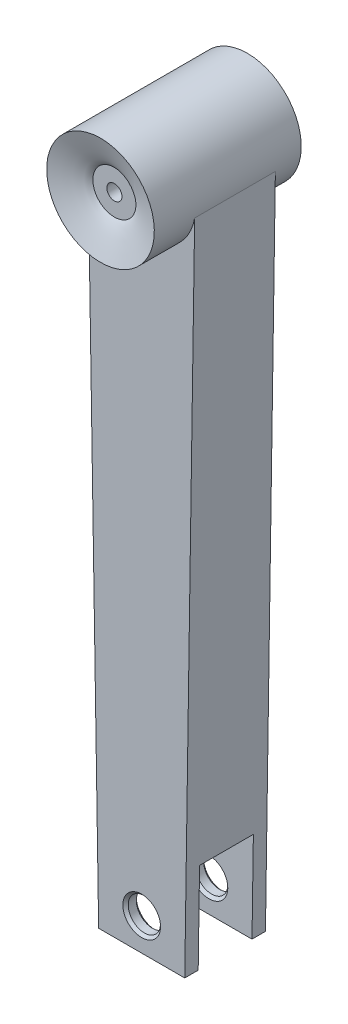
ISO-10303-21;
HEADER;
FILE_DESCRIPTION(('STEP AP214'),'2;1');
FILE_NAME('part.step','',(''),(''),'','','');
FILE_SCHEMA(('AUTOMOTIVE_DESIGN { 1 0 10303 214 1 1 1 1 }'));
ENDSEC;
DATA;
#1=APPLICATION_CONTEXT('core data for automotive mechanical design processes');
#2=APPLICATION_PROTOCOL_DEFINITION('international standard','automotive_design',2000,#1);
#3=PRODUCT_CONTEXT('',#1,'mechanical');
#4=PRODUCT('Part','Part','',(#3));
#5=PRODUCT_RELATED_PRODUCT_CATEGORY('part','',(#4));
#6=PRODUCT_DEFINITION_FORMATION('','',#4);
#7=PRODUCT_DEFINITION_CONTEXT('part definition',#1,'design');
#8=PRODUCT_DEFINITION('design','',#6,#7);
#9=PRODUCT_DEFINITION_SHAPE('','',#8);
#10=(LENGTH_UNIT() NAMED_UNIT(*) SI_UNIT(.MILLI.,.METRE.));
#11=(NAMED_UNIT(*) PLANE_ANGLE_UNIT() SI_UNIT($,.RADIAN.));
#12=(NAMED_UNIT(*) SI_UNIT($,.STERADIAN.) SOLID_ANGLE_UNIT());
#13=UNCERTAINTY_MEASURE_WITH_UNIT(LENGTH_MEASURE(1.E-05),#10,'distance_accuracy_value','');
#14=(GEOMETRIC_REPRESENTATION_CONTEXT(3) GLOBAL_UNCERTAINTY_ASSIGNED_CONTEXT((#13)) GLOBAL_UNIT_ASSIGNED_CONTEXT((#10,
#11,#12)) REPRESENTATION_CONTEXT('',''));
#15=CARTESIAN_POINT('',(0.,0.,0.));
#16=DIRECTION('',(0.,0.,1.));
#17=DIRECTION('',(1.,0.,0.));
#18=AXIS2_PLACEMENT_3D('',#15,#16,#17);
#19=CARTESIAN_POINT('',(0.,0.,28.));
#20=DIRECTION('',(0.,0.,-1.));
#21=DIRECTION('',(-1.,0.,0.));
#22=AXIS2_PLACEMENT_3D('',#19,#20,#21);
#23=CYLINDRICAL_SURFACE('',#22,4.);
#24=CARTESIAN_POINT('',(0.,0.,2.9278314769504));
#25=DIRECTION('',(0.,0.,-1.));
#26=DIRECTION('',(0.,1.,0.));
#27=AXIS2_PLACEMENT_3D('',#24,#25,#26);
#28=CIRCLE('',#27,4.);
#29=CARTESIAN_POINT('',(-4.,0.,2.9278314769504));
#30=VERTEX_POINT('',#29);
#31=EDGE_CURVE('E160',#30,#30,#28,.T.);
#32=CARTESIAN_POINT('',(0.,0.,22.0721685230496));
#33=DIRECTION('',(0.,0.,1.));
#34=DIRECTION('',(1.,0.,0.));
#35=AXIS2_PLACEMENT_3D('',#32,#33,#34);
#36=CIRCLE('',#35,4.);
#37=CARTESIAN_POINT('',(-4.,0.,22.0721685230496));
#38=VERTEX_POINT('',#37);
#39=EDGE_CURVE('E223',#38,#38,#36,.F.);
#40=CARTESIAN_POINT('',(-4.,0.,2.9278314769504));
#41=CARTESIAN_POINT('',(-4.,0.,3.12725165451393));
#42=CARTESIAN_POINT('',(-4.,0.,3.32667183207747));
#43=CARTESIAN_POINT('',(-4.,0.,3.72551218720453));
#44=CARTESIAN_POINT('',(-4.,0.,3.92493236476807));
#45=CARTESIAN_POINT('',(-4.,0.,4.32377271989513));
#46=CARTESIAN_POINT('',(-4.,0.,4.52319289745867));
#47=CARTESIAN_POINT('',(-4.,0.,4.92203325258573));
#48=CARTESIAN_POINT('',(-4.,0.,5.12145343014927));
#49=CARTESIAN_POINT('',(-4.,0.,5.52029378527633));
#50=CARTESIAN_POINT('',(-4.,0.,5.71971396283987));
#51=CARTESIAN_POINT('',(-4.,0.,6.11855431796693));
#52=CARTESIAN_POINT('',(-4.,0.,6.31797449553047));
#53=CARTESIAN_POINT('',(-4.,0.,6.71681485065753));
#54=CARTESIAN_POINT('',(-4.,0.,6.91623502822107));
#55=CARTESIAN_POINT('',(-4.,0.,7.31507538334814));
#56=CARTESIAN_POINT('',(-4.,0.,7.51449556091167));
#57=CARTESIAN_POINT('',(-4.,0.,7.91333591603873));
#58=CARTESIAN_POINT('',(-4.,0.,8.11275609360227));
#59=CARTESIAN_POINT('',(-4.,0.,8.51159644872934));
#60=CARTESIAN_POINT('',(-4.,0.,8.71101662629287));
#61=CARTESIAN_POINT('',(-4.,0.,9.10985698141993));
#62=CARTESIAN_POINT('',(-4.,0.,9.30927715898347));
#63=CARTESIAN_POINT('',(-4.,0.,9.70811751411054));
#64=CARTESIAN_POINT('',(-4.,0.,9.90753769167407));
#65=CARTESIAN_POINT('',(-4.,0.,10.3063780468011));
#66=CARTESIAN_POINT('',(-4.,0.,10.5057982243647));
#67=CARTESIAN_POINT('',(-4.,0.,10.9046385794917));
#68=CARTESIAN_POINT('',(-4.,0.,11.1040587570553));
#69=CARTESIAN_POINT('',(-4.,0.,11.5028991121823));
#70=CARTESIAN_POINT('',(-4.,0.,11.7023192897459));
#71=CARTESIAN_POINT('',(-4.,0.,12.1011596448729));
#72=CARTESIAN_POINT('',(-4.,0.,12.3005798224365));
#73=CARTESIAN_POINT('',(-4.,0.,12.6994201775635));
#74=CARTESIAN_POINT('',(-4.,0.,12.8988403551271));
#75=CARTESIAN_POINT('',(-4.,0.,13.2976807102541));
#76=CARTESIAN_POINT('',(-4.,0.,13.4971008878177));
#77=CARTESIAN_POINT('',(-4.,0.,13.8959412429447));
#78=CARTESIAN_POINT('',(-4.,0.,14.0953614205083));
#79=CARTESIAN_POINT('',(-4.,0.,14.4942017756353));
#80=CARTESIAN_POINT('',(-4.,0.,14.6936219531989));
#81=CARTESIAN_POINT('',(-4.,0.,15.0924623083259));
#82=CARTESIAN_POINT('',(-4.,0.,15.2918824858895));
#83=CARTESIAN_POINT('',(-4.,0.,15.6907228410165));
#84=CARTESIAN_POINT('',(-4.,0.,15.8901430185801));
#85=CARTESIAN_POINT('',(-4.,0.,16.2889833737071));
#86=CARTESIAN_POINT('',(-4.,0.,16.4884035512707));
#87=CARTESIAN_POINT('',(-4.,0.,16.8872439063977));
#88=CARTESIAN_POINT('',(-4.,0.,17.0866640839613));
#89=CARTESIAN_POINT('',(-4.,0.,17.4855044390883));
#90=CARTESIAN_POINT('',(-4.,0.,17.6849246166519));
#91=CARTESIAN_POINT('',(-4.,0.,18.0837649717789));
#92=CARTESIAN_POINT('',(-4.,0.,18.2831851493425));
#93=CARTESIAN_POINT('',(-4.,0.,18.6820255044695));
#94=CARTESIAN_POINT('',(-4.,0.,18.8814456820331));
#95=CARTESIAN_POINT('',(-4.,0.,19.2802860371601));
#96=CARTESIAN_POINT('',(-4.,0.,19.4797062147237));
#97=CARTESIAN_POINT('',(-4.,0.,19.8785465698507));
#98=CARTESIAN_POINT('',(-4.,0.,20.0779667474143));
#99=CARTESIAN_POINT('',(-4.,0.,20.4768071025413));
#100=CARTESIAN_POINT('',(-4.,0.,20.6762272801049));
#101=CARTESIAN_POINT('',(-4.,0.,21.0750676352319));
#102=CARTESIAN_POINT('',(-4.,0.,21.2744878127955));
#103=CARTESIAN_POINT('',(-4.,0.,21.6733281679225));
#104=CARTESIAN_POINT('',(-4.,0.,21.8727483454861));
#105=CARTESIAN_POINT('',(-4.,0.,22.0721685230496));
#106=B_SPLINE_CURVE_WITH_KNOTS('',3,(#40,#41,#42,#43,#44,#45,#46,#47,#48,#49,#50,#51,#52,#53,
#54,#55,#56,#57,#58,#59,#60,#61,#62,#63,#64,#65,#66,#67,#68,#69,#70,#71,#72,#73,#74,#75,#76,#77,
#78,#79,#80,#81,#82,#83,#84,#85,#86,#87,#88,#89,#90,#91,#92,#93,#94,#95,#96,#97,#98,#99,#100,
#101,#102,#103,#104,#105),.UNSPECIFIED.,.F.,.F.,(4,2,2,2,2,2,2,2,2,2,2,2,2,2,2,2,2,2,2,2,2,2,2,
2,2,2,2,2,2,2,2,2,4),(0.,0.5982605326906,1.1965210653812,1.7947815980718,2.3930421307624,
2.991302663453,3.5895631961436,4.1878237288342,4.7860842615248,5.3843447942154,5.982605326906,
6.5808658595966,7.1791263922872,7.7773869249778,8.3756474576684,8.973907990359,9.5721685230496,
10.1704290557402,10.7686895884308,11.3669501211214,11.965210653812,12.5634711865026,
13.1617317191932,13.7599922518838,14.3582527845744,14.956513317265,15.5547738499556,
16.1530343826462,16.7512949153368,17.3495554480274,17.947815980718,18.5460765134086,
19.1443370460992),.UNSPECIFIED.);
#107=EDGE_CURVE('BSEAM54',#30,#38,#106,.T.);
#108=ORIENTED_EDGE('',*,*,#31,.T.);
#109=ORIENTED_EDGE('',*,*,#39,.F.);
#110=ORIENTED_EDGE('',*,*,#107,.T.);
#111=ORIENTED_EDGE('',*,*,#107,.F.);
#112=EDGE_LOOP('',(#108,#110,#109,#111));
#113=FACE_BOUND('',#112,.T.);
#114=ADVANCED_FACE('F54',(#113),#23,.F.);
#115=CARTESIAN_POINT('',(-7.99999999999998,-125.,5.));
#116=DIRECTION('',(0.,-1.,0.));
#117=DIRECTION('',(0.,0.,-1.));
#118=AXIS2_PLACEMENT_3D('',#115,#116,#117);
#119=PLANE('',#118);
#120=DIRECTION('',(1.,0.,0.));
#121=VECTOR('',#120,1.);
#122=CARTESIAN_POINT('',(-7.99999999999998,-125.,7.5));
#123=LINE('',#122,#121);
#124=CARTESIAN_POINT('',(-7.99999999999999,-125.,7.5));
#125=VERTEX_POINT('',#124);
#126=CARTESIAN_POINT('',(8.00000000000002,-125.,7.5));
#127=VERTEX_POINT('',#126);
#128=EDGE_CURVE('E145',#125,#127,#123,.T.);
#129=ORIENTED_EDGE('',*,*,#128,.F.);
#130=DIRECTION('',(0.,0.,1.));
#131=VECTOR('',#130,1.);
#132=CARTESIAN_POINT('',(-7.99999999999998,-125.,5.));
#133=LINE('',#132,#131);
#134=CARTESIAN_POINT('',(-7.99999999999998,-125.,5.));
#135=VERTEX_POINT('',#134);
#136=EDGE_CURVE('E202',#135,#125,#133,.T.);
#137=ORIENTED_EDGE('',*,*,#136,.F.);
#138=DIRECTION('',(1.,0.,0.));
#139=VECTOR('',#138,1.);
#140=CARTESIAN_POINT('',(-7.99999999999998,-125.,5.));
#141=LINE('',#140,#139);
#142=CARTESIAN_POINT('',(8.00000000000002,-125.,5.));
#143=VERTEX_POINT('',#142);
#144=EDGE_CURVE('E174',#135,#143,#141,.T.);
#145=ORIENTED_EDGE('',*,*,#144,.T.);
#146=DIRECTION('',(0.,0.,1.));
#147=VECTOR('',#146,1.);
#148=CARTESIAN_POINT('',(8.00000000000002,-125.,5.));
#149=LINE('',#148,#147);
#150=EDGE_CURVE('E198',#143,#127,#149,.T.);
#151=ORIENTED_EDGE('',*,*,#150,.T.);
#152=EDGE_LOOP('',(#129,#137,#145,#151));
#153=FACE_BOUND('',#152,.T.);
#154=ADVANCED_FACE('F281',(#153),#119,.T.);
#155=CARTESIAN_POINT('',(0.,0.,28.));
#156=DIRECTION('',(0.,0.,-1.));
#157=DIRECTION('',(-1.,0.,0.));
#158=AXIS2_PLACEMENT_3D('',#155,#156,#157);
#159=CYLINDRICAL_SURFACE('',#158,10.);
#160=CARTESIAN_POINT('',(0.,0.,27.6527562815089));
#161=DIRECTION('',(0.,0.,-1.));
#162=DIRECTION('',(0.,1.,0.));
#163=AXIS2_PLACEMENT_3D('',#160,#161,#162);
#164=CIRCLE('',#163,10.);
#165=CARTESIAN_POINT('',(6.17755296118887,7.86370392446888,27.6527562815089));
#166=VERTEX_POINT('',#165);
#167=EDGE_CURVE('E156',#166,#166,#164,.T.);
#168=ORIENTED_EDGE('',*,*,#167,.T.);
#169=EDGE_LOOP('',(#168));
#170=FACE_BOUND('',#169,.T.);
#171=CARTESIAN_POINT('',(0.,0.,0.347243718491124));
#172=DIRECTION('',(0.,0.,-1.));
#173=DIRECTION('',(0.,1.,0.));
#174=AXIS2_PLACEMENT_3D('',#171,#172,#173);
#175=CIRCLE('',#174,10.);
#176=CARTESIAN_POINT('',(0.,10.,0.347243718491125));
#177=VERTEX_POINT('',#176);
#178=EDGE_CURVE('E161',#177,#177,#175,.F.);
#179=ORIENTED_EDGE('',*,*,#178,.T.);
#180=EDGE_LOOP('',(#179));
#181=FACE_BOUND('',#180,.T.);
#182=CARTESIAN_POINT('',(0.,0.,5.));
#183=DIRECTION('',(0.,0.,-1.));
#184=DIRECTION('',(1.,0.,0.));
#185=AXIS2_PLACEMENT_3D('',#182,#183,#184);
#186=CIRCLE('',#185,10.);
#187=CARTESIAN_POINT('',(9.84286813303339,-1.76577091258063,5.));
#188=VERTEX_POINT('',#187);
#189=CARTESIAN_POINT('',(-9.99871860541707,-0.160082009253309,5.));
#190=VERTEX_POINT('',#189);
#191=EDGE_CURVE('E166',#188,#190,#186,.T.);
#192=ORIENTED_EDGE('',*,*,#191,.T.);
#193=DIRECTION('',(0.,0.,1.));
#194=VECTOR('',#193,1.);
#195=CARTESIAN_POINT('',(-9.99871860541707,-0.160082009253309,5.));
#196=LINE('',#195,#194);
#197=CARTESIAN_POINT('',(-9.99871860541707,-0.160082009253309,20.));
#198=VERTEX_POINT('',#197);
#199=EDGE_CURVE('E182',#190,#198,#196,.T.);
#200=ORIENTED_EDGE('',*,*,#199,.T.);
#201=CARTESIAN_POINT('',(0.,0.,20.));
#202=DIRECTION('',(0.,0.,-1.));
#203=DIRECTION('',(1.,0.,0.));
#204=AXIS2_PLACEMENT_3D('',#201,#202,#203);
#205=CIRCLE('',#204,10.);
#206=CARTESIAN_POINT('',(9.84286813303339,-1.76577091258063,20.));
#207=VERTEX_POINT('',#206);
#208=EDGE_CURVE('E165',#207,#198,#205,.T.);
#209=ORIENTED_EDGE('',*,*,#208,.F.);
#210=DIRECTION('',(0.,0.,1.));
#211=VECTOR('',#210,1.);
#212=CARTESIAN_POINT('',(9.84286813303339,-1.76577091258063,5.));
#213=LINE('',#212,#211);
#214=EDGE_CURVE('E194',#188,#207,#213,.T.);
#215=ORIENTED_EDGE('',*,*,#214,.F.);
#216=EDGE_LOOP('',(#192,#200,#209,#215));
#217=FACE_BOUND('',#216,.T.);
#218=ADVANCED_FACE('F287',(#170,#181,#217),#159,.T.);
#219=CARTESIAN_POINT('',(9.84286813303339,-1.76577091258063,5.));
#220=DIRECTION('',(0.999888204843865,-0.0149525186545011,0.));
#221=DIRECTION('',(0.0149525186545011,0.999888204843865,0.));
#222=AXIS2_PLACEMENT_3D('',#219,#220,#221);
#223=PLANE('',#222);
#224=DIRECTION('',(0.0149525186545011,0.999888204843865,0.));
#225=VECTOR('',#224,1.);
#226=CARTESIAN_POINT('',(9.84286813303339,-1.76577091258063,7.50000000000002));
#227=LINE('',#226,#225);
#228=CARTESIAN_POINT('',(8.2542212378295,-108.,7.5));
#229=VERTEX_POINT('',#228);
#230=EDGE_CURVE('E149',#127,#229,#227,.T.);
#231=ORIENTED_EDGE('',*,*,#230,.F.);
#232=ORIENTED_EDGE('',*,*,#150,.F.);
#233=DIRECTION('',(0.0149525186545011,0.999888204843865,0.));
#234=VECTOR('',#233,1.);
#235=CARTESIAN_POINT('',(9.84286813303339,-1.76577091258063,5.));
#236=LINE('',#235,#234);
#237=EDGE_CURVE('E178',#143,#188,#236,.T.);
#238=ORIENTED_EDGE('',*,*,#237,.T.);
#239=ORIENTED_EDGE('',*,*,#214,.T.);
#240=DIRECTION('',(0.0149525186545011,0.999888204843865,0.));
#241=VECTOR('',#240,1.);
#242=CARTESIAN_POINT('',(9.84286813303339,-1.76577091258063,20.));
#243=LINE('',#242,#241);
#244=CARTESIAN_POINT('',(8.00000000000002,-125.,20.));
#245=VERTEX_POINT('',#244);
#246=EDGE_CURVE('E79',#245,#207,#243,.T.);
#247=ORIENTED_EDGE('',*,*,#246,.F.);
#248=CARTESIAN_POINT('',(8.00000000000002,-125.,17.5));
#249=VERTEX_POINT('',#248);
#250=EDGE_CURVE('E143',#249,#245,#149,.T.);
#251=ORIENTED_EDGE('',*,*,#250,.F.);
#252=DIRECTION('',(-0.0149525186545011,-0.999888204843865,0.));
#253=VECTOR('',#252,1.);
#254=CARTESIAN_POINT('',(9.84286813303339,-1.76577091258063,17.5));
#255=LINE('',#254,#253);
#256=CARTESIAN_POINT('',(8.2542212378295,-108.,17.5));
#257=VERTEX_POINT('',#256);
#258=EDGE_CURVE('E134',#257,#249,#255,.T.);
#259=ORIENTED_EDGE('',*,*,#258,.F.);
#260=DIRECTION('',(0.,0.,1.));
#261=VECTOR('',#260,1.);
#262=CARTESIAN_POINT('',(8.25422123782951,-108.,5.));
#263=LINE('',#262,#261);
#264=EDGE_CURVE('E122',#229,#257,#263,.T.);
#265=ORIENTED_EDGE('',*,*,#264,.F.);
#266=EDGE_LOOP('',(#231,#232,#238,#239,#247,#251,#259,#265));
#267=FACE_BOUND('',#266,.T.);
#268=ADVANCED_FACE('F142',(#267),#223,.T.);
#269=DIRECTION('',(-1.,0.,0.));
#270=VECTOR('',#269,1.);
#271=CARTESIAN_POINT('',(-7.99999999999998,-125.,17.5));
#272=LINE('',#271,#270);
#273=CARTESIAN_POINT('',(-7.99999999999999,-125.,17.5));
#274=VERTEX_POINT('',#273);
#275=EDGE_CURVE('E130',#249,#274,#272,.T.);
#276=ORIENTED_EDGE('',*,*,#275,.F.);
#277=ORIENTED_EDGE('',*,*,#250,.T.);
#278=DIRECTION('',(1.,0.,0.));
#279=VECTOR('',#278,1.);
#280=CARTESIAN_POINT('',(-7.99999999999998,-125.,20.));
#281=LINE('',#280,#279);
#282=CARTESIAN_POINT('',(-7.99999999999998,-125.,20.));
#283=VERTEX_POINT('',#282);
#284=EDGE_CURVE('E189',#283,#245,#281,.T.);
#285=ORIENTED_EDGE('',*,*,#284,.F.);
#286=EDGE_CURVE('E206',#274,#283,#133,.T.);
#287=ORIENTED_EDGE('',*,*,#286,.F.);
#288=EDGE_LOOP('',(#276,#277,#285,#287));
#289=FACE_BOUND('',#288,.T.);
#290=ADVANCED_FACE('F290',(#289),#119,.T.);
#291=CARTESIAN_POINT('',(-9.99871860541707,-0.160082009253309,5.));
#292=DIRECTION('',(-0.999871860541707,-0.0160082009253309,0.));
#293=DIRECTION('',(0.0160082009253309,-0.999871860541707,0.));
#294=AXIS2_PLACEMENT_3D('',#291,#292,#293);
#295=PLANE('',#294);
#296=DIRECTION('',(0.0160082009253309,-0.999871860541707,0.));
#297=VECTOR('',#296,1.);
#298=CARTESIAN_POINT('',(-9.99871860541707,-0.160082009253309,7.50000000000002));
#299=LINE('',#298,#297);
#300=CARTESIAN_POINT('',(-8.27217429199695,-108.,7.5));
#301=VERTEX_POINT('',#300);
#302=EDGE_CURVE('E220',#301,#125,#299,.T.);
#303=ORIENTED_EDGE('',*,*,#302,.F.);
#304=DIRECTION('',(0.,0.,-1.));
#305=VECTOR('',#304,1.);
#306=CARTESIAN_POINT('',(-8.27217429199695,-108.,5.));
#307=LINE('',#306,#305);
#308=CARTESIAN_POINT('',(-8.27217429199695,-108.,17.5));
#309=VERTEX_POINT('',#308);
#310=EDGE_CURVE('E197',#309,#301,#307,.T.);
#311=ORIENTED_EDGE('',*,*,#310,.F.);
#312=DIRECTION('',(-0.0160082009253309,0.999871860541707,0.));
#313=VECTOR('',#312,1.);
#314=CARTESIAN_POINT('',(-9.99871860541707,-0.160082009253311,17.5));
#315=LINE('',#314,#313);
#316=EDGE_CURVE('E137',#274,#309,#315,.T.);
#317=ORIENTED_EDGE('',*,*,#316,.F.);
#318=ORIENTED_EDGE('',*,*,#286,.T.);
#319=DIRECTION('',(0.0160082009253309,-0.999871860541707,0.));
#320=VECTOR('',#319,1.);
#321=CARTESIAN_POINT('',(-9.99871860541707,-0.160082009253309,20.));
#322=LINE('',#321,#320);
#323=EDGE_CURVE('E185',#198,#283,#322,.T.);
#324=ORIENTED_EDGE('',*,*,#323,.F.);
#325=ORIENTED_EDGE('',*,*,#199,.F.);
#326=DIRECTION('',(0.0160082009253309,-0.999871860541707,0.));
#327=VECTOR('',#326,1.);
#328=CARTESIAN_POINT('',(-9.99871860541707,-0.160082009253309,5.));
#329=LINE('',#328,#327);
#330=EDGE_CURVE('E170',#190,#135,#329,.T.);
#331=ORIENTED_EDGE('',*,*,#330,.T.);
#332=ORIENTED_EDGE('',*,*,#136,.T.);
#333=EDGE_LOOP('',(#303,#311,#317,#318,#324,#325,#331,#332));
#334=FACE_BOUND('',#333,.T.);
#335=ADVANCED_FACE('F302',(#334),#295,.T.);
#336=CARTESIAN_POINT('',(0.,0.,5.));
#337=DIRECTION('',(0.,0.,1.));
#338=DIRECTION('',(1.,0.,0.));
#339=AXIS2_PLACEMENT_3D('',#336,#337,#338);
#340=PLANE('',#339);
#341=CARTESIAN_POINT('',(0.,-119.,5.));
#342=DIRECTION('',(0.,0.,1.));
#343=DIRECTION('',(1.,0.,0.));
#344=AXIS2_PLACEMENT_3D('',#341,#342,#343);
#345=CIRCLE('',#344,3.49999999999996);
#346=CARTESIAN_POINT('',(3.49999999999998,-119.,5.));
#347=VERTEX_POINT('',#346);
#348=EDGE_CURVE('E227',#347,#347,#345,.T.);
#349=ORIENTED_EDGE('',*,*,#348,.T.);
#350=EDGE_LOOP('',(#349));
#351=FACE_BOUND('',#350,.T.);
#352=ORIENTED_EDGE('',*,*,#191,.F.);
#353=ORIENTED_EDGE('',*,*,#237,.F.);
#354=ORIENTED_EDGE('',*,*,#144,.F.);
#355=ORIENTED_EDGE('',*,*,#330,.F.);
#356=EDGE_LOOP('',(#352,#353,#354,#355));
#357=FACE_BOUND('',#356,.T.);
#358=ADVANCED_FACE('F298',(#351,#357),#340,.F.);
#359=CARTESIAN_POINT('',(0.,0.,20.));
#360=DIRECTION('',(0.,0.,1.));
#361=DIRECTION('',(1.,0.,0.));
#362=AXIS2_PLACEMENT_3D('',#359,#360,#361);
#363=PLANE('',#362);
#364=CARTESIAN_POINT('',(0.,-119.,20.));
#365=DIRECTION('',(0.,0.,1.));
#366=DIRECTION('',(1.,0.,0.));
#367=AXIS2_PLACEMENT_3D('',#364,#365,#366);
#368=CIRCLE('',#367,3.50000000000006);
#369=CARTESIAN_POINT('',(3.50000000000007,-119.,20.));
#370=VERTEX_POINT('',#369);
#371=EDGE_CURVE('E12',#370,#370,#368,.F.);
#372=ORIENTED_EDGE('',*,*,#371,.T.);
#373=EDGE_LOOP('',(#372));
#374=FACE_BOUND('',#373,.T.);
#375=ORIENTED_EDGE('',*,*,#208,.T.);
#376=ORIENTED_EDGE('',*,*,#323,.T.);
#377=ORIENTED_EDGE('',*,*,#284,.T.);
#378=ORIENTED_EDGE('',*,*,#246,.T.);
#379=EDGE_LOOP('',(#375,#376,#377,#378));
#380=FACE_BOUND('',#379,.T.);
#381=ADVANCED_FACE('F301',(#374,#380),#363,.T.);
#382=CARTESIAN_POINT('',(3.29127638558231,-2.27321353016127,3.76));
#383=CARTESIAN_POINT('',(6.47122802264515,8.89512270173561,0.));
#384=CARTESIAN_POINT('',(-1.25515067474022,-8.85576630132589,3.76));
#385=CARTESIAN_POINT('',(24.2614734261163,-4.04733334355467,0.));
#386=CARTESIAN_POINT('',(-7.83770344590484,-4.30933924100335,3.76));
#387=CARTESIAN_POINT('',(11.3190173808261,-21.8375787470259,0.));
#388=CARTESIAN_POINT('',(-3.29127638558231,2.27321353016127,3.76));
#389=CARTESIAN_POINT('',(-6.47122802264514,-8.89512270173562,0.));
#390=CARTESIAN_POINT('',(1.25515067474022,8.85576630132589,3.76));
#391=CARTESIAN_POINT('',(-24.2614734261164,4.04733334355465,0.));
#392=CARTESIAN_POINT('',(7.83770344590484,4.30933924100335,3.76));
#393=CARTESIAN_POINT('',(-11.3190173808261,21.8375787470259,0.));
#394=CARTESIAN_POINT('',(3.29127638558231,-2.27321353016127,3.76));
#395=CARTESIAN_POINT('',(6.47122802264515,8.89512270173561,0.));
#396=(BOUNDED_SURFACE() B_SPLINE_SURFACE(3,1,((#382,#383),(#384,#385),(#386,#387),(#388,#389),
(#390,#391),(#392,#393),(#394,#395)),.UNSPECIFIED.,.T.,.F.,.F.) B_SPLINE_SURFACE_WITH_KNOTS((4,
3,4),(2,2),(0.,0.5,1.),(0.,1.),
.UNSPECIFIED.) GEOMETRIC_REPRESENTATION_ITEM() RATIONAL_B_SPLINE_SURFACE(((1.,1.),
(0.333333333333333,0.333333333333334),(0.333333333333333,0.333333333333334),(1.,1.),
(0.333333333333333,0.333333333333333),(0.333333333333333,0.333333333333333),(1.,1.))) REPRESENTATION_ITEM('') SURFACE());
#397=ORIENTED_EDGE('',*,*,#31,.F.);
#398=EDGE_LOOP('',(#397));
#399=FACE_BOUND('',#398,.T.);
#400=ORIENTED_EDGE('',*,*,#178,.F.);
#401=EDGE_LOOP('',(#400));
#402=FACE_BOUND('',#401,.T.);
#403=ADVANCED_FACE('F294',(#399,#402),#396,.F.);
#404=CARTESIAN_POINT('',(3.29127638558231,-2.27321353016127,24.24));
#405=CARTESIAN_POINT('',(6.47122802264515,8.89512270173561,28.));
#406=CARTESIAN_POINT('',(-1.25515067474022,-8.85576630132589,24.24));
#407=CARTESIAN_POINT('',(24.2614734261163,-4.04733334355467,28.));
#408=CARTESIAN_POINT('',(-7.83770344590484,-4.30933924100335,24.24));
#409=CARTESIAN_POINT('',(11.3190173808261,-21.8375787470259,28.));
#410=CARTESIAN_POINT('',(-3.29127638558231,2.27321353016127,24.24));
#411=CARTESIAN_POINT('',(-6.47122802264514,-8.89512270173562,28.));
#412=CARTESIAN_POINT('',(1.25515067474022,8.85576630132589,24.24));
#413=CARTESIAN_POINT('',(-24.2614734261164,4.04733334355465,28.));
#414=CARTESIAN_POINT('',(7.83770344590484,4.30933924100335,24.24));
#415=CARTESIAN_POINT('',(-11.3190173808261,21.8375787470259,28.));
#416=CARTESIAN_POINT('',(3.29127638558231,-2.27321353016127,24.24));
#417=CARTESIAN_POINT('',(6.47122802264515,8.89512270173561,28.));
#418=(BOUNDED_SURFACE() B_SPLINE_SURFACE(3,1,((#404,#405),(#406,#407),(#408,#409),(#410,#411),
(#412,#413),(#414,#415),(#416,#417)),.UNSPECIFIED.,.T.,.F.,.F.) B_SPLINE_SURFACE_WITH_KNOTS((4,
3,4),(2,2),(0.,0.5,1.),(0.,1.),
.UNSPECIFIED.) GEOMETRIC_REPRESENTATION_ITEM() RATIONAL_B_SPLINE_SURFACE(((1.,1.),
(0.333333333333333,0.333333333333334),(0.333333333333333,0.333333333333334),(1.,1.),
(0.333333333333333,0.333333333333333),(0.333333333333333,0.333333333333333),(1.,1.))) REPRESENTATION_ITEM('') SURFACE());
#419=CARTESIAN_POINT('',(0.,0.,25.0721685230496));
#420=DIRECTION('',(0.,0.,-1.));
#421=DIRECTION('',(0.,1.,0.));
#422=AXIS2_PLACEMENT_3D('',#419,#420,#421);
#423=CIRCLE('',#422,4.);
#424=CARTESIAN_POINT('',(3.99506778376947,0.198578455748031,25.0721685230496));
#425=VERTEX_POINT('',#424);
#426=EDGE_CURVE('E155',#425,#425,#423,.F.);
#427=CARTESIAN_POINT('',(3.99506778376947,0.198578455748031,25.0721685230496));
#428=CARTESIAN_POINT('',(4.01780200436759,0.278423512713873,25.0990496455336));
#429=CARTESIAN_POINT('',(4.04053622496571,0.358268569679716,25.1259307680175));
#430=CARTESIAN_POINT('',(4.08600466616195,0.5179586836114,25.1796930129854));
#431=CARTESIAN_POINT('',(4.10873888676007,0.597803740577242,25.2065741354694));
#432=CARTESIAN_POINT('',(4.15420732795631,0.757493854508926,25.2603363804373));
#433=CARTESIAN_POINT('',(4.17694154855442,0.837338911474769,25.2872175029212));
#434=CARTESIAN_POINT('',(4.22240998975066,0.997029025406453,25.3409797478891));
#435=CARTESIAN_POINT('',(4.24514421034878,1.0768740823723,25.3678608703731));
#436=CARTESIAN_POINT('',(4.29061265154502,1.23656419630398,25.421623115341));
#437=CARTESIAN_POINT('',(4.31334687214314,1.31640925326982,25.4485042378249));
#438=CARTESIAN_POINT('',(4.35881531333937,1.47609936720151,25.5022664827928));
#439=CARTESIAN_POINT('',(4.38154953393749,1.55594442416735,25.5291476052768));
#440=CARTESIAN_POINT('',(4.42701797513373,1.71563453809903,25.5829098502447));
#441=CARTESIAN_POINT('',(4.44975219573185,1.79547959506487,25.6097909727286));
#442=CARTESIAN_POINT('',(4.49522063692809,1.95516970899656,25.6635532176965));
#443=CARTESIAN_POINT('',(4.5179548575262,2.0350147659624,25.6904343401805));
#444=CARTESIAN_POINT('',(4.56342329872244,2.19470487989409,25.7441965851484));
#445=CARTESIAN_POINT('',(4.58615751932056,2.27454993685993,25.7710777076323));
#446=CARTESIAN_POINT('',(4.6316259605168,2.43424005079161,25.8248399526002));
#447=CARTESIAN_POINT('',(4.65436018111492,2.51408510775746,25.8517210750842));
#448=CARTESIAN_POINT('',(4.69982862231115,2.67377522168914,25.9054833200521));
#449=CARTESIAN_POINT('',(4.72256284290927,2.75362027865498,25.932364442536));
#450=CARTESIAN_POINT('',(4.76803128410551,2.91331039258667,25.9861266875039));
#451=CARTESIAN_POINT('',(4.79076550470363,2.99315544955251,26.0130078099879));
#452=CARTESIAN_POINT('',(4.83623394589987,3.15284556348419,26.0667700549558));
#453=CARTESIAN_POINT('',(4.85896816649798,3.23269062045003,26.0936511774397));
#454=CARTESIAN_POINT('',(4.90443660769422,3.39238073438172,26.1474134224076));
#455=CARTESIAN_POINT('',(4.92717082829234,3.47222579134756,26.1742945448916));
#456=CARTESIAN_POINT('',(4.97263926948858,3.63191590527925,26.2280567898595));
#457=CARTESIAN_POINT('',(4.9953734900867,3.71176096224509,26.2549379123434));
#458=CARTESIAN_POINT('',(5.04084193128293,3.87145107617677,26.3087001573113));
#459=CARTESIAN_POINT('',(5.06357615188105,3.95129613314262,26.3355812797953));
#460=CARTESIAN_POINT('',(5.10904459307729,4.1109862470743,26.3893435247632));
#461=CARTESIAN_POINT('',(5.13177881367541,4.19083130404014,26.4162246472471));
#462=CARTESIAN_POINT('',(5.17724725487165,4.35052141797182,26.4699868922151));
#463=CARTESIAN_POINT('',(5.19998147546976,4.43036647493767,26.496868014699));
#464=CARTESIAN_POINT('',(5.245449916666,4.59005658886935,26.5506302596669));
#465=CARTESIAN_POINT('',(5.26818413726412,4.66990164583519,26.5775113821509));
#466=CARTESIAN_POINT('',(5.31365257846036,4.82959175976688,26.6312736271188));
#467=CARTESIAN_POINT('',(5.33638679905848,4.90943681673272,26.6581547496027));
#468=CARTESIAN_POINT('',(5.38185524025471,5.0691269306644,26.7119169945706));
#469=CARTESIAN_POINT('',(5.40458946085283,5.14897198763025,26.7387981170546));
#470=CARTESIAN_POINT('',(5.45005790204907,5.30866210156193,26.7925603620225));
#471=CARTESIAN_POINT('',(5.47279212264719,5.38850715852777,26.8194414845064));
#472=CARTESIAN_POINT('',(5.51826056384343,5.54819727245946,26.8732037294743));
#473=CARTESIAN_POINT('',(5.54099478444155,5.6280423294253,26.9000848519583));
#474=CARTESIAN_POINT('',(5.58646322563778,5.78773244335699,26.9538470969262));
#475=CARTESIAN_POINT('',(5.6091974462359,5.86757750032283,26.9807282194101));
#476=CARTESIAN_POINT('',(5.65466588743214,6.02726761425451,27.034490464378));
#477=CARTESIAN_POINT('',(5.67740010803026,6.10711267122035,27.061371586862));
#478=CARTESIAN_POINT('',(5.72286854922649,6.26680278515204,27.1151338318299));
#479=CARTESIAN_POINT('',(5.74560276982461,6.34664784211788,27.1420149543138));
#480=CARTESIAN_POINT('',(5.79107121102085,6.50633795604957,27.1957771992817));
#481=CARTESIAN_POINT('',(5.81380543161897,6.58618301301541,27.2226583217657));
#482=CARTESIAN_POINT('',(5.85927387281521,6.74587312694709,27.2764205667336));
#483=CARTESIAN_POINT('',(5.88200809341333,6.82571818391293,27.3033016892175));
#484=CARTESIAN_POINT('',(5.92747653460956,6.98540829784462,27.3570639341854));
#485=CARTESIAN_POINT('',(5.95021075520768,7.06525335481046,27.3839450566694));
#486=CARTESIAN_POINT('',(5.99567919640392,7.22494346874215,27.4377073016373));
#487=CARTESIAN_POINT('',(6.01841341700204,7.30478852570799,27.4645884241212));
#488=CARTESIAN_POINT('',(6.06388185819828,7.46447863963967,27.5183506690891));
#489=CARTESIAN_POINT('',(6.08661607879639,7.54432369660551,27.5452317915731));
#490=CARTESIAN_POINT('',(6.13208451999263,7.7040138105372,27.598994036541));
#491=CARTESIAN_POINT('',(6.15481874059075,7.78385886750304,27.6258751590249));
#492=CARTESIAN_POINT('',(6.17755296118887,7.86370392446888,27.6527562815089));
#493=B_SPLINE_CURVE_WITH_KNOTS('',3,(#427,#428,#429,#430,#431,#432,#433,#434,#435,#436,#437,
#438,#439,#440,#441,#442,#443,#444,#445,#446,#447,#448,#449,#450,#451,#452,#453,#454,#455,#456,
#457,#458,#459,#460,#461,#462,#463,#464,#465,#466,#467,#468,#469,#470,#471,#472,#473,#474,#475,
#476,#477,#478,#479,#480,#481,#482,#483,#484,#485,#486,#487,#488,#489,#490,#491,#492),
.UNSPECIFIED.,.F.,.F.,(4,2,2,2,2,2,2,2,2,2,2,2,2,2,2,2,2,2,2,2,2,2,2,2,2,2,2,2,2,2,2,2,4),(0.,
0.261786275206927,0.523572550413854,0.785358825620781,1.04714510082771,1.30893137603464,
1.57071765124156,1.83250392644849,2.09429020165542,2.35607647686235,2.61786275206927,
2.8796490272762,3.14143530248313,3.40322157769005,3.66500785289698,3.92679412810391,
4.18858040331084,4.45036667851776,4.71215295372469,4.97393922893162,5.23572550413855,
5.49751177934547,5.7592980545524,6.02108432975933,6.28287060496626,6.54465688017318,
6.80644315538011,7.06822943058704,7.33001570579397,7.59180198100089,7.85358825620782,
8.11537453141475,8.37716080662168),.UNSPECIFIED.);
#494=EDGE_CURVE('BSEAM276',#425,#166,#493,.T.);
#495=ORIENTED_EDGE('',*,*,#426,.F.);
#496=ORIENTED_EDGE('',*,*,#167,.F.);
#497=ORIENTED_EDGE('',*,*,#494,.T.);
#498=ORIENTED_EDGE('',*,*,#494,.F.);
#499=EDGE_LOOP('',(#495,#497,#496,#498));
#500=FACE_BOUND('',#499,.T.);
#501=ADVANCED_FACE('F276',(#500),#418,.T.);
#502=CARTESIAN_POINT('',(-11.9820725652616,-108.,7.5));
#503=DIRECTION('',(0.,0.,-1.));
#504=DIRECTION('',(0.,1.,0.));
#505=AXIS2_PLACEMENT_3D('',#502,#503,#504);
#506=PLANE('',#505);
#507=CARTESIAN_POINT('',(0.,-119.,7.5));
#508=DIRECTION('',(0.,0.,-1.));
#509=DIRECTION('',(0.,1.,0.));
#510=AXIS2_PLACEMENT_3D('',#507,#508,#509);
#511=CIRCLE('',#510,3.49999999999996);
#512=CARTESIAN_POINT('',(0.,-115.5,7.5));
#513=VERTEX_POINT('',#512);
#514=EDGE_CURVE('E244',#513,#513,#511,.T.);
#515=ORIENTED_EDGE('',*,*,#514,.T.);
#516=EDGE_LOOP('',(#515));
#517=FACE_BOUND('',#516,.T.);
#518=ORIENTED_EDGE('',*,*,#230,.T.);
#519=DIRECTION('',(1.,0.,0.));
#520=VECTOR('',#519,1.);
#521=CARTESIAN_POINT('',(-11.9820725652616,-108.,7.5));
#522=LINE('',#521,#520);
#523=EDGE_CURVE('E125',#301,#229,#522,.T.);
#524=ORIENTED_EDGE('',*,*,#523,.F.);
#525=ORIENTED_EDGE('',*,*,#302,.T.);
#526=ORIENTED_EDGE('',*,*,#128,.T.);
#527=EDGE_LOOP('',(#518,#524,#525,#526));
#528=FACE_BOUND('',#527,.T.);
#529=ADVANCED_FACE('F269',(#517,#528),#506,.F.);
#530=CARTESIAN_POINT('',(-11.9820725652616,-108.,17.5));
#531=DIRECTION('',(0.,0.,1.));
#532=DIRECTION('',(0.,-1.,0.));
#533=AXIS2_PLACEMENT_3D('',#530,#531,#532);
#534=PLANE('',#533);
#535=CARTESIAN_POINT('',(0.,-119.,17.5));
#536=DIRECTION('',(0.,0.,1.));
#537=DIRECTION('',(0.,-1.,0.));
#538=AXIS2_PLACEMENT_3D('',#535,#536,#537);
#539=CIRCLE('',#538,3.49999999999996);
#540=CARTESIAN_POINT('',(0.,-122.5,17.5));
#541=VERTEX_POINT('',#540);
#542=EDGE_CURVE('E248',#541,#541,#539,.T.);
#543=ORIENTED_EDGE('',*,*,#542,.T.);
#544=EDGE_LOOP('',(#543));
#545=FACE_BOUND('',#544,.T.);
#546=ORIENTED_EDGE('',*,*,#258,.T.);
#547=ORIENTED_EDGE('',*,*,#275,.T.);
#548=ORIENTED_EDGE('',*,*,#316,.T.);
#549=DIRECTION('',(1.,0.,0.));
#550=VECTOR('',#549,1.);
#551=CARTESIAN_POINT('',(-11.9820725652616,-108.,17.5));
#552=LINE('',#551,#550);
#553=EDGE_CURVE('E71',#309,#257,#552,.T.);
#554=ORIENTED_EDGE('',*,*,#553,.T.);
#555=EDGE_LOOP('',(#546,#547,#548,#554));
#556=FACE_BOUND('',#555,.T.);
#557=ADVANCED_FACE('F133',(#545,#556),#534,.F.);
#558=CARTESIAN_POINT('',(-11.9820725652616,-108.,17.5));
#559=DIRECTION('',(0.,1.,0.));
#560=DIRECTION('',(0.,0.,1.));
#561=AXIS2_PLACEMENT_3D('',#558,#559,#560);
#562=PLANE('',#561);
#563=ORIENTED_EDGE('',*,*,#264,.T.);
#564=ORIENTED_EDGE('',*,*,#553,.F.);
#565=ORIENTED_EDGE('',*,*,#310,.T.);
#566=ORIENTED_EDGE('',*,*,#523,.T.);
#567=EDGE_LOOP('',(#563,#564,#565,#566));
#568=FACE_BOUND('',#567,.T.);
#569=ADVANCED_FACE('F123',(#568),#562,.F.);
#570=CARTESIAN_POINT('',(0.,-119.,27.6527562815089));
#571=DIRECTION('',(0.,0.,-1.));
#572=DIRECTION('',(-1.,0.,0.));
#573=AXIS2_PLACEMENT_3D('',#570,#571,#572);
#574=CYLINDRICAL_SURFACE('',#573,3.);
#575=CARTESIAN_POINT('',(0.,-119.,18.));
#576=DIRECTION('',(0.,0.,1.));
#577=DIRECTION('',(1.,0.,0.));
#578=AXIS2_PLACEMENT_3D('',#575,#576,#577);
#579=CIRCLE('',#578,3.);
#580=CARTESIAN_POINT('',(-2.99999999999999,-119.,18.));
#581=VERTEX_POINT('',#580);
#582=EDGE_CURVE('E64',#581,#581,#579,.F.);
#583=CARTESIAN_POINT('',(0.,-119.,19.4999999999999));
#584=DIRECTION('',(0.,0.,1.));
#585=DIRECTION('',(1.,0.,0.));
#586=AXIS2_PLACEMENT_3D('',#583,#584,#585);
#587=CIRCLE('',#586,3.);
#588=CARTESIAN_POINT('',(-2.99999999999999,-119.,19.4999999999999));
#589=VERTEX_POINT('',#588);
#590=EDGE_CURVE('E252',#589,#589,#587,.T.);
#591=CARTESIAN_POINT('',(-2.99999999999999,-119.,18.));
#592=CARTESIAN_POINT('',(-2.99999999999999,-119.,18.015625));
#593=CARTESIAN_POINT('',(-2.99999999999999,-119.,18.03125));
#594=CARTESIAN_POINT('',(-2.99999999999999,-119.,18.0625));
#595=CARTESIAN_POINT('',(-2.99999999999999,-119.,18.078125));
#596=CARTESIAN_POINT('',(-2.99999999999999,-119.,18.109375));
#597=CARTESIAN_POINT('',(-2.99999999999999,-119.,18.125));
#598=CARTESIAN_POINT('',(-2.99999999999999,-119.,18.15625));
#599=CARTESIAN_POINT('',(-2.99999999999999,-119.,18.171875));
#600=CARTESIAN_POINT('',(-2.99999999999999,-119.,18.203125));
#601=CARTESIAN_POINT('',(-2.99999999999999,-119.,18.21875));
#602=CARTESIAN_POINT('',(-2.99999999999999,-119.,18.25));
#603=CARTESIAN_POINT('',(-2.99999999999999,-119.,18.265625));
#604=CARTESIAN_POINT('',(-2.99999999999999,-119.,18.296875));
#605=CARTESIAN_POINT('',(-2.99999999999999,-119.,18.3125));
#606=CARTESIAN_POINT('',(-2.99999999999999,-119.,18.3437499999999));
#607=CARTESIAN_POINT('',(-2.99999999999999,-119.,18.359375));
#608=CARTESIAN_POINT('',(-2.99999999999999,-119.,18.390625));
#609=CARTESIAN_POINT('',(-2.99999999999999,-119.,18.4062499999999));
#610=CARTESIAN_POINT('',(-2.99999999999999,-119.,18.4375));
#611=CARTESIAN_POINT('',(-2.99999999999999,-119.,18.453125));
#612=CARTESIAN_POINT('',(-2.99999999999999,-119.,18.484375));
#613=CARTESIAN_POINT('',(-2.99999999999999,-119.,18.4999999999999));
#614=CARTESIAN_POINT('',(-2.99999999999999,-119.,18.5312499999999));
#615=CARTESIAN_POINT('',(-2.99999999999999,-119.,18.5468749999999));
#616=CARTESIAN_POINT('',(-2.99999999999999,-119.,18.578125));
#617=CARTESIAN_POINT('',(-2.99999999999999,-119.,18.5937499999999));
#618=CARTESIAN_POINT('',(-2.99999999999999,-119.,18.6249999999999));
#619=CARTESIAN_POINT('',(-2.99999999999999,-119.,18.6406249999999));
#620=CARTESIAN_POINT('',(-2.99999999999999,-119.,18.6718749999999));
#621=CARTESIAN_POINT('',(-2.99999999999999,-119.,18.6874999999999));
#622=CARTESIAN_POINT('',(-2.99999999999999,-119.,18.7187499999999));
#623=CARTESIAN_POINT('',(-2.99999999999999,-119.,18.7343749999999));
#624=CARTESIAN_POINT('',(-2.99999999999999,-119.,18.7656249999999));
#625=CARTESIAN_POINT('',(-2.99999999999999,-119.,18.7812499999999));
#626=CARTESIAN_POINT('',(-2.99999999999999,-119.,18.8124999999999));
#627=CARTESIAN_POINT('',(-2.99999999999999,-119.,18.8281249999999));
#628=CARTESIAN_POINT('',(-2.99999999999999,-119.,18.8593749999999));
#629=CARTESIAN_POINT('',(-2.99999999999999,-119.,18.8749999999999));
#630=CARTESIAN_POINT('',(-2.99999999999999,-119.,18.9062499999999));
#631=CARTESIAN_POINT('',(-2.99999999999999,-119.,18.9218749999999));
#632=CARTESIAN_POINT('',(-2.99999999999999,-119.,18.9531249999999));
#633=CARTESIAN_POINT('',(-2.99999999999999,-119.,18.9687499999999));
#634=CARTESIAN_POINT('',(-2.99999999999999,-119.,18.9999999999999));
#635=CARTESIAN_POINT('',(-2.99999999999999,-119.,19.0156249999999));
#636=CARTESIAN_POINT('',(-2.99999999999999,-119.,19.0468749999999));
#637=CARTESIAN_POINT('',(-2.99999999999999,-119.,19.0624999999999));
#638=CARTESIAN_POINT('',(-2.99999999999999,-119.,19.0937499999999));
#639=CARTESIAN_POINT('',(-2.99999999999999,-119.,19.1093749999999));
#640=CARTESIAN_POINT('',(-2.99999999999999,-119.,19.1406249999999));
#641=CARTESIAN_POINT('',(-2.99999999999999,-119.,19.1562499999999));
#642=CARTESIAN_POINT('',(-2.99999999999999,-119.,19.1874999999999));
#643=CARTESIAN_POINT('',(-2.99999999999999,-119.,19.2031249999999));
#644=CARTESIAN_POINT('',(-2.99999999999999,-119.,19.2343749999999));
#645=CARTESIAN_POINT('',(-2.99999999999999,-119.,19.2499999999999));
#646=CARTESIAN_POINT('',(-2.99999999999999,-119.,19.2812499999999));
#647=CARTESIAN_POINT('',(-2.99999999999999,-119.,19.2968749999999));
#648=CARTESIAN_POINT('',(-2.99999999999999,-119.,19.3281249999999));
#649=CARTESIAN_POINT('',(-2.99999999999999,-119.,19.3437499999999));
#650=CARTESIAN_POINT('',(-2.99999999999999,-119.,19.3749999999999));
#651=CARTESIAN_POINT('',(-2.99999999999999,-119.,19.3906249999999));
#652=CARTESIAN_POINT('',(-2.99999999999999,-119.,19.4218749999999));
#653=CARTESIAN_POINT('',(-2.99999999999999,-119.,19.4374999999999));
#654=CARTESIAN_POINT('',(-2.99999999999999,-119.,19.4687499999999));
#655=CARTESIAN_POINT('',(-2.99999999999999,-119.,19.4843749999999));
#656=CARTESIAN_POINT('',(-2.99999999999999,-119.,19.4999999999999));
#657=B_SPLINE_CURVE_WITH_KNOTS('',3,(#591,#592,#593,#594,#595,#596,#597,#598,#599,#600,#601,
#602,#603,#604,#605,#606,#607,#608,#609,#610,#611,#612,#613,#614,#615,#616,#617,#618,#619,#620,
#621,#622,#623,#624,#625,#626,#627,#628,#629,#630,#631,#632,#633,#634,#635,#636,#637,#638,#639,
#640,#641,#642,#643,#644,#645,#646,#647,#648,#649,#650,#651,#652,#653,#654,#655,#656),
.UNSPECIFIED.,.F.,.F.,(4,2,2,2,2,2,2,2,2,2,2,2,2,2,2,2,2,2,2,2,2,2,2,2,2,2,2,2,2,2,2,2,4),(0.,
0.0468749999999983,0.0937499999999966,0.140624999999998,0.187499999999997,0.234374999999995,
0.281249999999997,0.328124999999995,0.374999999999993,0.421874999999995,0.468749999999997,
0.515624999999992,0.562499999999994,0.609374999999995,0.65624999999999,0.703124999999992,
0.749999999999994,0.796874999999992,0.84374999999999,0.890624999999992,0.93749999999999,
0.984374999999989,1.03124999999999,1.07812499999999,1.12499999999999,1.17187499999999,
1.21874999999999,1.26562499999999,1.31249999999999,1.35937499999999,1.40624999999998,
1.45312499999999,1.49999999999999),.UNSPECIFIED.);
#658=EDGE_CURVE('BSEAM259',#581,#589,#657,.T.);
#659=ORIENTED_EDGE('',*,*,#582,.T.);
#660=ORIENTED_EDGE('',*,*,#590,.T.);
#661=ORIENTED_EDGE('',*,*,#658,.T.);
#662=ORIENTED_EDGE('',*,*,#658,.F.);
#663=EDGE_LOOP('',(#659,#661,#660,#662));
#664=FACE_BOUND('',#663,.T.);
#665=ADVANCED_FACE('F259',(#664),#574,.F.);
#666=CARTESIAN_POINT('',(0.,-119.,5.49999999999995));
#667=DIRECTION('',(0.,0.,1.));
#668=DIRECTION('',(1.,0.,0.));
#669=AXIS2_PLACEMENT_3D('',#666,#667,#668);
#670=CIRCLE('',#669,3.);
#671=CARTESIAN_POINT('',(-2.99999999999999,-119.,5.49999999999995));
#672=VERTEX_POINT('',#671);
#673=EDGE_CURVE('E240',#672,#672,#670,.F.);
#674=CARTESIAN_POINT('',(0.,-119.,7.00000000000005));
#675=DIRECTION('',(0.,0.,-1.));
#676=DIRECTION('',(-1.,0.,0.));
#677=AXIS2_PLACEMENT_3D('',#674,#675,#676);
#678=CIRCLE('',#677,3.);
#679=CARTESIAN_POINT('',(-2.99999999999999,-119.,7.00000000000005));
#680=VERTEX_POINT('',#679);
#681=EDGE_CURVE('E236',#680,#680,#678,.F.);
#682=CARTESIAN_POINT('',(-2.99999999999999,-119.,5.49999999999995));
#683=CARTESIAN_POINT('',(-2.99999999999999,-119.,5.51562499999995));
#684=CARTESIAN_POINT('',(-2.99999999999999,-119.,5.53124999999995));
#685=CARTESIAN_POINT('',(-2.99999999999999,-119.,5.56249999999995));
#686=CARTESIAN_POINT('',(-2.99999999999999,-119.,5.57812499999995));
#687=CARTESIAN_POINT('',(-2.99999999999999,-119.,5.60937499999995));
#688=CARTESIAN_POINT('',(-2.99999999999999,-119.,5.62499999999995));
#689=CARTESIAN_POINT('',(-2.99999999999999,-119.,5.65624999999996));
#690=CARTESIAN_POINT('',(-2.99999999999999,-119.,5.67187499999996));
#691=CARTESIAN_POINT('',(-2.99999999999999,-119.,5.70312499999996));
#692=CARTESIAN_POINT('',(-2.99999999999999,-119.,5.71874999999996));
#693=CARTESIAN_POINT('',(-2.99999999999999,-119.,5.74999999999996));
#694=CARTESIAN_POINT('',(-2.99999999999999,-119.,5.76562499999997));
#695=CARTESIAN_POINT('',(-2.99999999999999,-119.,5.79687499999997));
#696=CARTESIAN_POINT('',(-2.99999999999999,-119.,5.81249999999997));
#697=CARTESIAN_POINT('',(-2.99999999999999,-119.,5.84374999999997));
#698=CARTESIAN_POINT('',(-2.99999999999999,-119.,5.85937499999997));
#699=CARTESIAN_POINT('',(-2.99999999999999,-119.,5.89062499999998));
#700=CARTESIAN_POINT('',(-2.99999999999999,-119.,5.90624999999998));
#701=CARTESIAN_POINT('',(-2.99999999999999,-119.,5.93749999999998));
#702=CARTESIAN_POINT('',(-2.99999999999999,-119.,5.95312499999998));
#703=CARTESIAN_POINT('',(-2.99999999999999,-119.,5.98437499999998));
#704=CARTESIAN_POINT('',(-2.99999999999999,-119.,5.99999999999998));
#705=CARTESIAN_POINT('',(-2.99999999999999,-119.,6.03124999999998));
#706=CARTESIAN_POINT('',(-2.99999999999999,-119.,6.04687499999998));
#707=CARTESIAN_POINT('',(-2.99999999999999,-119.,6.07812499999999));
#708=CARTESIAN_POINT('',(-2.99999999999999,-119.,6.09374999999999));
#709=CARTESIAN_POINT('',(-2.99999999999999,-119.,6.12499999999999));
#710=CARTESIAN_POINT('',(-2.99999999999999,-119.,6.14062499999999));
#711=CARTESIAN_POINT('',(-2.99999999999999,-119.,6.17187499999999));
#712=CARTESIAN_POINT('',(-2.99999999999999,-119.,6.18749999999999));
#713=CARTESIAN_POINT('',(-2.99999999999999,-119.,6.21875));
#714=CARTESIAN_POINT('',(-2.99999999999999,-119.,6.234375));
#715=CARTESIAN_POINT('',(-2.99999999999999,-119.,6.265625));
#716=CARTESIAN_POINT('',(-2.99999999999999,-119.,6.28125));
#717=CARTESIAN_POINT('',(-2.99999999999999,-119.,6.3125));
#718=CARTESIAN_POINT('',(-2.99999999999999,-119.,6.328125));
#719=CARTESIAN_POINT('',(-2.99999999999999,-119.,6.35937500000001));
#720=CARTESIAN_POINT('',(-2.99999999999999,-119.,6.37500000000001));
#721=CARTESIAN_POINT('',(-2.99999999999999,-119.,6.40625000000001));
#722=CARTESIAN_POINT('',(-2.99999999999999,-119.,6.42187500000001));
#723=CARTESIAN_POINT('',(-2.99999999999999,-119.,6.45312500000001));
#724=CARTESIAN_POINT('',(-2.99999999999999,-119.,6.46875000000001));
#725=CARTESIAN_POINT('',(-2.99999999999999,-119.,6.50000000000002));
#726=CARTESIAN_POINT('',(-2.99999999999999,-119.,6.51562500000002));
#727=CARTESIAN_POINT('',(-2.99999999999999,-119.,6.54687500000002));
#728=CARTESIAN_POINT('',(-2.99999999999999,-119.,6.56250000000002));
#729=CARTESIAN_POINT('',(-2.99999999999999,-119.,6.59375000000002));
#730=CARTESIAN_POINT('',(-2.99999999999999,-119.,6.60937500000002));
#731=CARTESIAN_POINT('',(-2.99999999999999,-119.,6.64062500000002));
#732=CARTESIAN_POINT('',(-2.99999999999999,-119.,6.65625000000003));
#733=CARTESIAN_POINT('',(-2.99999999999999,-119.,6.68750000000003));
#734=CARTESIAN_POINT('',(-2.99999999999999,-119.,6.70312500000003));
#735=CARTESIAN_POINT('',(-2.99999999999999,-119.,6.73437500000003));
#736=CARTESIAN_POINT('',(-2.99999999999999,-119.,6.75000000000003));
#737=CARTESIAN_POINT('',(-2.99999999999999,-119.,6.78125000000004));
#738=CARTESIAN_POINT('',(-2.99999999999999,-119.,6.79687500000004));
#739=CARTESIAN_POINT('',(-2.99999999999999,-119.,6.82812500000004));
#740=CARTESIAN_POINT('',(-2.99999999999999,-119.,6.84375000000004));
#741=CARTESIAN_POINT('',(-2.99999999999999,-119.,6.87500000000004));
#742=CARTESIAN_POINT('',(-2.99999999999999,-119.,6.89062500000004));
#743=CARTESIAN_POINT('',(-2.99999999999999,-119.,6.92187500000005));
#744=CARTESIAN_POINT('',(-2.99999999999999,-119.,6.93750000000005));
#745=CARTESIAN_POINT('',(-2.99999999999999,-119.,6.96875000000005));
#746=CARTESIAN_POINT('',(-2.99999999999999,-119.,6.98437500000005));
#747=CARTESIAN_POINT('',(-2.99999999999999,-119.,7.00000000000005));
#748=B_SPLINE_CURVE_WITH_KNOTS('',3,(#682,#683,#684,#685,#686,#687,#688,#689,#690,#691,#692,
#693,#694,#695,#696,#697,#698,#699,#700,#701,#702,#703,#704,#705,#706,#707,#708,#709,#710,#711,
#712,#713,#714,#715,#716,#717,#718,#719,#720,#721,#722,#723,#724,#725,#726,#727,#728,#729,#730,
#731,#732,#733,#734,#735,#736,#737,#738,#739,#740,#741,#742,#743,#744,#745,#746,#747),
.UNSPECIFIED.,.F.,.F.,(4,2,2,2,2,2,2,2,2,2,2,2,2,2,2,2,2,2,2,2,2,2,2,2,2,2,2,2,2,2,2,2,4),(0.,
0.0468750000000018,0.093750000000007,0.140625000000009,0.187500000000014,0.234375000000016,
0.281250000000021,0.328125000000023,0.375000000000028,0.42187500000003,0.468750000000032,
0.515625000000037,0.562500000000039,0.609375000000044,0.656250000000046,0.703125000000051,
0.750000000000053,0.796875000000055,0.84375000000006,0.890625000000062,0.937500000000067,
0.984375000000069,1.03125000000007,1.07812500000008,1.12500000000008,1.17187500000008,
1.21875000000008,1.26562500000009,1.31250000000009,1.3593750000001,1.4062500000001,
1.4531250000001,1.50000000000011),.UNSPECIFIED.);
#749=EDGE_CURVE('BSEAM374',#672,#680,#748,.T.);
#750=ORIENTED_EDGE('',*,*,#673,.T.);
#751=ORIENTED_EDGE('',*,*,#681,.T.);
#752=ORIENTED_EDGE('',*,*,#749,.T.);
#753=ORIENTED_EDGE('',*,*,#749,.F.);
#754=EDGE_LOOP('',(#750,#752,#751,#753));
#755=FACE_BOUND('',#754,.T.);
#756=ADVANCED_FACE('F374',(#755),#574,.F.);
#757=CARTESIAN_POINT('',(0.,0.,25.0721685230496));
#758=DIRECTION('',(0.,0.,1.));
#759=DIRECTION('',(1.,0.,0.));
#760=AXIS2_PLACEMENT_3D('',#757,#758,#759);
#761=PLANE('',#760);
#762=CARTESIAN_POINT('',(0.,0.,25.0721685230496));
#763=DIRECTION('',(0.,0.,1.));
#764=DIRECTION('',(1.,0.,0.));
#765=AXIS2_PLACEMENT_3D('',#762,#763,#764);
#766=CIRCLE('',#765,1.4);
#767=CARTESIAN_POINT('',(1.4,0.,25.0721685230496));
#768=VERTEX_POINT('',#767);
#769=EDGE_CURVE('E228',#768,#768,#766,.T.);
#770=ORIENTED_EDGE('',*,*,#769,.F.);
#771=EDGE_LOOP('',(#770));
#772=FACE_BOUND('',#771,.T.);
#773=ORIENTED_EDGE('',*,*,#426,.T.);
#774=EDGE_LOOP('',(#773));
#775=FACE_BOUND('',#774,.T.);
#776=ADVANCED_FACE('F365',(#772,#775),#761,.T.);
#777=CARTESIAN_POINT('',(0.,0.,22.0721685230496));
#778=DIRECTION('',(0.,0.,1.));
#779=DIRECTION('',(1.,0.,0.));
#780=AXIS2_PLACEMENT_3D('',#777,#778,#779);
#781=PLANE('',#780);
#782=CARTESIAN_POINT('',(0.,0.,22.0721685230496));
#783=DIRECTION('',(0.,0.,-1.));
#784=DIRECTION('',(-1.,0.,0.));
#785=AXIS2_PLACEMENT_3D('',#782,#783,#784);
#786=CIRCLE('',#785,1.4);
#787=CARTESIAN_POINT('',(-1.4,0.,22.0721685230496));
#788=VERTEX_POINT('',#787);
#789=EDGE_CURVE('E232',#788,#788,#786,.T.);
#790=ORIENTED_EDGE('',*,*,#789,.F.);
#791=EDGE_LOOP('',(#790));
#792=FACE_BOUND('',#791,.T.);
#793=ORIENTED_EDGE('',*,*,#39,.T.);
#794=EDGE_LOOP('',(#793));
#795=FACE_BOUND('',#794,.T.);
#796=ADVANCED_FACE('F362',(#792,#795),#781,.F.);
#797=CARTESIAN_POINT('',(0.,0.,27.6527562815089));
#798=DIRECTION('',(0.,0.,-1.));
#799=DIRECTION('',(-1.,0.,0.));
#800=AXIS2_PLACEMENT_3D('',#797,#798,#799);
#801=CYLINDRICAL_SURFACE('',#800,1.4);
#802=ORIENTED_EDGE('',*,*,#769,.T.);
#803=EDGE_LOOP('',(#802));
#804=FACE_BOUND('',#803,.T.);
#805=ORIENTED_EDGE('',*,*,#789,.T.);
#806=EDGE_LOOP('',(#805));
#807=FACE_BOUND('',#806,.T.);
#808=ADVANCED_FACE('F324',(#804,#807),#801,.F.);
#809=CARTESIAN_POINT('',(0.,-119.,5.));
#810=DIRECTION('',(0.,0.,-1.));
#811=DIRECTION('',(-1.,0.,0.));
#812=AXIS2_PLACEMENT_3D('',#809,#810,#811);
#813=CONICAL_SURFACE('',#812,3.49999999999996,0.785398163397459);
#814=ORIENTED_EDGE('',*,*,#673,.F.);
#815=EDGE_LOOP('',(#814));
#816=FACE_BOUND('',#815,.T.);
#817=ORIENTED_EDGE('',*,*,#348,.F.);
#818=EDGE_LOOP('',(#817));
#819=FACE_BOUND('',#818,.T.);
#820=ADVANCED_FACE('F318',(#816,#819),#813,.F.);
#821=CARTESIAN_POINT('',(0.,-119.,7.5));
#822=DIRECTION('',(0.,0.,1.));
#823=DIRECTION('',(1.,0.,0.));
#824=AXIS2_PLACEMENT_3D('',#821,#822,#823);
#825=CONICAL_SURFACE('',#824,3.49999999999996,0.785398163397453);
#826=ORIENTED_EDGE('',*,*,#681,.F.);
#827=EDGE_LOOP('',(#826));
#828=FACE_BOUND('',#827,.T.);
#829=ORIENTED_EDGE('',*,*,#514,.F.);
#830=EDGE_LOOP('',(#829));
#831=FACE_BOUND('',#830,.T.);
#832=ADVANCED_FACE('F265',(#828,#831),#825,.F.);
#833=CARTESIAN_POINT('',(0.,-119.,17.5));
#834=DIRECTION('',(0.,0.,-1.));
#835=DIRECTION('',(-1.,0.,0.));
#836=AXIS2_PLACEMENT_3D('',#833,#834,#835);
#837=CONICAL_SURFACE('',#836,3.49999999999996,0.785398163397453);
#838=ORIENTED_EDGE('',*,*,#582,.F.);
#839=EDGE_LOOP('',(#838));
#840=FACE_BOUND('',#839,.T.);
#841=ORIENTED_EDGE('',*,*,#542,.F.);
#842=EDGE_LOOP('',(#841));
#843=FACE_BOUND('',#842,.T.);
#844=ADVANCED_FACE('F262',(#840,#843),#837,.F.);
#845=CARTESIAN_POINT('',(0.,-119.,19.4999999999999));
#846=DIRECTION('',(0.,0.,1.));
#847=DIRECTION('',(1.,0.,0.));
#848=AXIS2_PLACEMENT_3D('',#845,#846,#847);
#849=CONICAL_SURFACE('',#848,3.,0.785398163397445);
#850=ORIENTED_EDGE('',*,*,#371,.F.);
#851=EDGE_LOOP('',(#850));
#852=FACE_BOUND('',#851,.T.);
#853=ORIENTED_EDGE('',*,*,#590,.F.);
#854=EDGE_LOOP('',(#853));
#855=FACE_BOUND('',#854,.T.);
#856=ADVANCED_FACE('F57',(#852,#855),#849,.F.);
#857=CLOSED_SHELL('',(#114,#154,#218,#268,#290,#335,#358,#381,#403,#501,#529,#557,#569,#665,
#756,#776,#796,#808,#820,#832,#844,#856));
#858=MANIFOLD_SOLID_BREP('B2',#857);
#859=ADVANCED_BREP_SHAPE_REPRESENTATION('',(#18,#858),#14);
#860=SHAPE_DEFINITION_REPRESENTATION(#9,#859);
ENDSEC;
END-ISO-10303-21;
